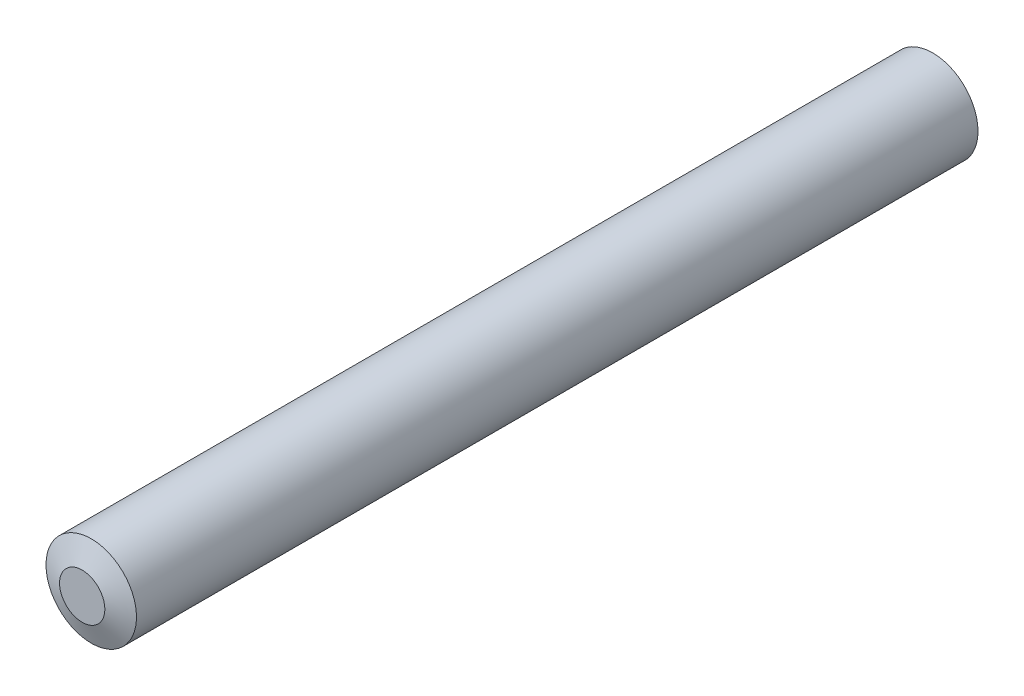
ISO-10303-21;
HEADER;
FILE_DESCRIPTION(('STEP AP214'),'2;1');
FILE_NAME('part.step','',(''),(''),'','','');
FILE_SCHEMA(('AUTOMOTIVE_DESIGN { 1 0 10303 214 1 1 1 1 }'));
ENDSEC;
DATA;
#1=APPLICATION_CONTEXT('core data for automotive mechanical design processes');
#2=APPLICATION_PROTOCOL_DEFINITION('international standard','automotive_design',2000,#1);
#3=PRODUCT_CONTEXT('',#1,'mechanical');
#4=PRODUCT('Part','Part','',(#3));
#5=PRODUCT_RELATED_PRODUCT_CATEGORY('part','',(#4));
#6=PRODUCT_DEFINITION_FORMATION('','',#4);
#7=PRODUCT_DEFINITION_CONTEXT('part definition',#1,'design');
#8=PRODUCT_DEFINITION('design','',#6,#7);
#9=PRODUCT_DEFINITION_SHAPE('','',#8);
#10=(LENGTH_UNIT() NAMED_UNIT(*) SI_UNIT(.MILLI.,.METRE.));
#11=(NAMED_UNIT(*) PLANE_ANGLE_UNIT() SI_UNIT($,.RADIAN.));
#12=(NAMED_UNIT(*) SI_UNIT($,.STERADIAN.) SOLID_ANGLE_UNIT());
#13=UNCERTAINTY_MEASURE_WITH_UNIT(LENGTH_MEASURE(1.E-05),#10,'distance_accuracy_value','');
#14=(GEOMETRIC_REPRESENTATION_CONTEXT(3) GLOBAL_UNCERTAINTY_ASSIGNED_CONTEXT((#13)) GLOBAL_UNIT_ASSIGNED_CONTEXT((#10,
#11,#12)) REPRESENTATION_CONTEXT('',''));
#15=CARTESIAN_POINT('',(0.,0.,0.));
#16=DIRECTION('',(0.,0.,1.));
#17=DIRECTION('',(1.,0.,0.));
#18=AXIS2_PLACEMENT_3D('',#15,#16,#17);
#19=CARTESIAN_POINT('',(0.,0.,37.9999999999999));
#20=DIRECTION('',(0.,0.,-0.999999999999997));
#21=DIRECTION('',(-0.999999999999997,0.,0.));
#22=AXIS2_PLACEMENT_3D('',#19,#20,#21);
#23=CYLINDRICAL_SURFACE('',#22,2.);
#24=CARTESIAN_POINT('',(0.,0.,0.399999999999991));
#25=DIRECTION('',(0.,0.,0.999999999999997));
#26=DIRECTION('',(0.999999999999997,0.,0.));
#27=AXIS2_PLACEMENT_3D('',#24,#25,#26);
#28=CIRCLE('',#27,2.);
#29=CARTESIAN_POINT('',(-2.00000000000002,0.,0.399999999999998));
#30=VERTEX_POINT('',#29);
#31=EDGE_CURVE('E36',#30,#30,#28,.T.);
#32=CARTESIAN_POINT('',(0.,0.,37.5999999999999));
#33=DIRECTION('',(0.,0.,0.999999999999997));
#34=DIRECTION('',(0.999999999999997,0.,0.));
#35=AXIS2_PLACEMENT_3D('',#32,#33,#34);
#36=CIRCLE('',#35,2.);
#37=CARTESIAN_POINT('',(-2.00000000000002,0.,37.5999999999999));
#38=VERTEX_POINT('',#37);
#39=EDGE_CURVE('E40',#38,#38,#36,.F.);
#40=CARTESIAN_POINT('',(-2.00000000000002,0.,0.399999999999998));
#41=CARTESIAN_POINT('',(-2.00000000000002,0.,0.787499999999994));
#42=CARTESIAN_POINT('',(-2.00000000000002,0.,1.17499999999999));
#43=CARTESIAN_POINT('',(-2.00000000000002,0.,1.94999999999999));
#44=CARTESIAN_POINT('',(-2.00000000000002,0.,2.33749999999999));
#45=CARTESIAN_POINT('',(-2.00000000000002,0.,3.11249999999999));
#46=CARTESIAN_POINT('',(-2.00000000000002,0.,3.49999999999998));
#47=CARTESIAN_POINT('',(-2.00000000000002,0.,4.27499999999998));
#48=CARTESIAN_POINT('',(-2.00000000000002,0.,4.66249999999998));
#49=CARTESIAN_POINT('',(-2.00000000000002,0.,5.43749999999998));
#50=CARTESIAN_POINT('',(-2.00000000000002,0.,5.82499999999998));
#51=CARTESIAN_POINT('',(-2.00000000000002,0.,6.59999999999997));
#52=CARTESIAN_POINT('',(-2.00000000000002,0.,6.98749999999997));
#53=CARTESIAN_POINT('',(-2.00000000000002,0.,7.76249999999997));
#54=CARTESIAN_POINT('',(-2.00000000000002,0.,8.14999999999997));
#55=CARTESIAN_POINT('',(-2.00000000000002,0.,8.92499999999997));
#56=CARTESIAN_POINT('',(-2.00000000000002,0.,9.31249999999997));
#57=CARTESIAN_POINT('',(-2.00000000000002,0.,10.0875));
#58=CARTESIAN_POINT('',(-2.00000000000002,0.,10.475));
#59=CARTESIAN_POINT('',(-2.00000000000002,0.,11.25));
#60=CARTESIAN_POINT('',(-2.00000000000002,0.,11.6375));
#61=CARTESIAN_POINT('',(-2.00000000000002,0.,12.4125));
#62=CARTESIAN_POINT('',(-2.00000000000002,0.,12.8));
#63=CARTESIAN_POINT('',(-2.00000000000002,0.,13.575));
#64=CARTESIAN_POINT('',(-2.00000000000002,0.,13.9625));
#65=CARTESIAN_POINT('',(-2.00000000000002,0.,14.7374999999999));
#66=CARTESIAN_POINT('',(-2.00000000000002,0.,15.1249999999999));
#67=CARTESIAN_POINT('',(-2.00000000000002,0.,15.8999999999999));
#68=CARTESIAN_POINT('',(-2.00000000000002,0.,16.2874999999999));
#69=CARTESIAN_POINT('',(-2.00000000000002,0.,17.0624999999999));
#70=CARTESIAN_POINT('',(-2.00000000000002,0.,17.4499999999999));
#71=CARTESIAN_POINT('',(-2.00000000000002,0.,18.2249999999999));
#72=CARTESIAN_POINT('',(-2.00000000000002,0.,18.6124999999999));
#73=CARTESIAN_POINT('',(-2.00000000000002,0.,19.3874999999999));
#74=CARTESIAN_POINT('',(-2.00000000000002,0.,19.7749999999999));
#75=CARTESIAN_POINT('',(-2.00000000000002,0.,20.5499999999999));
#76=CARTESIAN_POINT('',(-2.00000000000002,0.,20.9374999999999));
#77=CARTESIAN_POINT('',(-2.00000000000002,0.,21.7124999999999));
#78=CARTESIAN_POINT('',(-2.00000000000002,0.,22.0999999999999));
#79=CARTESIAN_POINT('',(-2.00000000000002,0.,22.8749999999999));
#80=CARTESIAN_POINT('',(-2.00000000000002,0.,23.2624999999999));
#81=CARTESIAN_POINT('',(-2.00000000000002,0.,24.0374999999999));
#82=CARTESIAN_POINT('',(-2.00000000000002,0.,24.4249999999999));
#83=CARTESIAN_POINT('',(-2.00000000000002,0.,25.1999999999999));
#84=CARTESIAN_POINT('',(-2.00000000000002,0.,25.5874999999999));
#85=CARTESIAN_POINT('',(-2.00000000000002,0.,26.3624999999999));
#86=CARTESIAN_POINT('',(-2.00000000000002,0.,26.7499999999999));
#87=CARTESIAN_POINT('',(-2.00000000000002,0.,27.5249999999999));
#88=CARTESIAN_POINT('',(-2.00000000000002,0.,27.9124999999999));
#89=CARTESIAN_POINT('',(-2.00000000000002,0.,28.6874999999999));
#90=CARTESIAN_POINT('',(-2.00000000000002,0.,29.0749999999999));
#91=CARTESIAN_POINT('',(-2.00000000000002,0.,29.8499999999999));
#92=CARTESIAN_POINT('',(-2.00000000000002,0.,30.2374999999999));
#93=CARTESIAN_POINT('',(-2.00000000000002,0.,31.0124999999999));
#94=CARTESIAN_POINT('',(-2.00000000000002,0.,31.3999999999999));
#95=CARTESIAN_POINT('',(-2.00000000000002,0.,32.1749999999999));
#96=CARTESIAN_POINT('',(-2.00000000000002,0.,32.5624999999999));
#97=CARTESIAN_POINT('',(-2.00000000000002,0.,33.3374999999999));
#98=CARTESIAN_POINT('',(-2.00000000000002,0.,33.7249999999999));
#99=CARTESIAN_POINT('',(-2.00000000000002,0.,34.4999999999999));
#100=CARTESIAN_POINT('',(-2.00000000000002,0.,34.8874999999999));
#101=CARTESIAN_POINT('',(-2.00000000000002,0.,35.6624999999999));
#102=CARTESIAN_POINT('',(-2.00000000000002,0.,36.0499999999999));
#103=CARTESIAN_POINT('',(-2.00000000000002,0.,36.8249999999999));
#104=CARTESIAN_POINT('',(-2.00000000000002,0.,37.2124999999999));
#105=CARTESIAN_POINT('',(-2.00000000000002,0.,37.5999999999999));
#106=B_SPLINE_CURVE_WITH_KNOTS('',3,(#40,#41,#42,#43,#44,#45,#46,#47,#48,#49,#50,#51,#52,#53,
#54,#55,#56,#57,#58,#59,#60,#61,#62,#63,#64,#65,#66,#67,#68,#69,#70,#71,#72,#73,#74,#75,#76,#77,
#78,#79,#80,#81,#82,#83,#84,#85,#86,#87,#88,#89,#90,#91,#92,#93,#94,#95,#96,#97,#98,#99,#100,
#101,#102,#103,#104,#105),.UNSPECIFIED.,.F.,.F.,(4,2,2,2,2,2,2,2,2,2,2,2,2,2,2,2,2,2,2,2,2,2,2,
2,2,2,2,2,2,2,2,2,4),(0.,1.16249999999999,2.32499999999999,3.48749999999998,4.64999999999999,
5.81249999999998,6.97499999999997,8.13749999999997,9.29999999999997,10.4625,11.625,12.7875,
13.95,15.1124999999999,16.2749999999999,17.4374999999999,18.5999999999999,19.7624999999999,
20.9249999999999,22.0874999999999,23.2499999999999,24.4124999999999,25.5749999999999,
26.7374999999999,27.8999999999999,29.0624999999999,30.2249999999999,31.3874999999999,
32.5499999999999,33.7124999999999,34.8749999999999,36.0374999999999,37.1999999999999),.UNSPECIFIED.);
#107=EDGE_CURVE('BSEAM30',#30,#38,#106,.T.);
#108=ORIENTED_EDGE('',*,*,#31,.T.);
#109=ORIENTED_EDGE('',*,*,#39,.T.);
#110=ORIENTED_EDGE('',*,*,#107,.T.);
#111=ORIENTED_EDGE('',*,*,#107,.F.);
#112=EDGE_LOOP('',(#108,#110,#109,#111));
#113=FACE_BOUND('',#112,.T.);
#114=ADVANCED_FACE('F30',(#113),#23,.T.);
#115=CARTESIAN_POINT('',(0.,0.,37.9999999999999));
#116=DIRECTION('',(0.,0.,0.999999999999997));
#117=DIRECTION('',(0.999999999999997,0.,0.));
#118=AXIS2_PLACEMENT_3D('',#115,#116,#117);
#119=PLANE('',#118);
#120=CARTESIAN_POINT('',(0.,0.,37.9999999999999));
#121=DIRECTION('',(0.,0.,0.999999999999997));
#122=DIRECTION('',(0.999999999999997,0.,0.));
#123=AXIS2_PLACEMENT_3D('',#120,#121,#122);
#124=CIRCLE('',#123,0.999999999999987);
#125=CARTESIAN_POINT('',(-1.,0.,37.9999999999999));
#126=VERTEX_POINT('',#125);
#127=EDGE_CURVE('E44',#126,#126,#124,.T.);
#128=ORIENTED_EDGE('',*,*,#127,.T.);
#129=EDGE_LOOP('',(#128));
#130=FACE_BOUND('',#129,.T.);
#131=ADVANCED_FACE('F50',(#130),#119,.T.);
#132=CARTESIAN_POINT('',(0.,0.,0.));
#133=DIRECTION('',(0.,0.,0.999999999999997));
#134=DIRECTION('',(0.999999999999997,0.,0.));
#135=AXIS2_PLACEMENT_3D('',#132,#133,#134);
#136=PLANE('',#135);
#137=CARTESIAN_POINT('',(0.,0.,0.));
#138=DIRECTION('',(0.,0.,0.999999999999997));
#139=DIRECTION('',(0.999999999999997,0.,0.));
#140=AXIS2_PLACEMENT_3D('',#137,#138,#139);
#141=CIRCLE('',#140,0.999999999999994);
#142=CARTESIAN_POINT('',(0.999999999999984,0.,0.));
#143=VERTEX_POINT('',#142);
#144=EDGE_CURVE('E10',#143,#143,#141,.F.);
#145=ORIENTED_EDGE('',*,*,#144,.T.);
#146=EDGE_LOOP('',(#145));
#147=FACE_BOUND('',#146,.T.);
#148=ADVANCED_FACE('F55',(#147),#136,.F.);
#149=CARTESIAN_POINT('',(0.,0.,37.9999999999999));
#150=DIRECTION('',(0.,0.,-0.999999999999997));
#151=DIRECTION('',(-0.999999999999997,0.,0.));
#152=AXIS2_PLACEMENT_3D('',#149,#150,#151);
#153=CONICAL_SURFACE('',#152,0.999999999999987,1.19028994968254);
#154=CARTESIAN_POINT('',(-2.00000000000005,0.,37.5999999999999));
#155=CARTESIAN_POINT('',(-1.98958333333338,0.,37.6041666666665));
#156=CARTESIAN_POINT('',(-1.97916666666672,0.,37.6083333333332));
#157=CARTESIAN_POINT('',(-1.95833333333338,0.,37.6166666666665));
#158=CARTESIAN_POINT('',(-1.94791666666672,0.,37.6208333333332));
#159=CARTESIAN_POINT('',(-1.92708333333338,0.,37.6291666666665));
#160=CARTESIAN_POINT('',(-1.91666666666671,0.,37.6333333333332));
#161=CARTESIAN_POINT('',(-1.89583333333338,0.,37.6416666666665));
#162=CARTESIAN_POINT('',(-1.88541666666671,0.,37.6458333333332));
#163=CARTESIAN_POINT('',(-1.86458333333338,0.,37.6541666666665));
#164=CARTESIAN_POINT('',(-1.85416666666671,0.,37.6583333333332));
#165=CARTESIAN_POINT('',(-1.83333333333338,0.,37.6666666666665));
#166=CARTESIAN_POINT('',(-1.82291666666671,0.,37.6708333333332));
#167=CARTESIAN_POINT('',(-1.80208333333338,0.,37.6791666666665));
#168=CARTESIAN_POINT('',(-1.79166666666671,0.,37.6833333333332));
#169=CARTESIAN_POINT('',(-1.77083333333337,0.,37.6916666666665));
#170=CARTESIAN_POINT('',(-1.76041666666671,0.,37.6958333333332));
#171=CARTESIAN_POINT('',(-1.73958333333337,0.,37.7041666666665));
#172=CARTESIAN_POINT('',(-1.7291666666667,0.,37.7083333333332));
#173=CARTESIAN_POINT('',(-1.70833333333337,0.,37.7166666666665));
#174=CARTESIAN_POINT('',(-1.6979166666667,0.,37.7208333333332));
#175=CARTESIAN_POINT('',(-1.67708333333337,0.,37.7291666666665));
#176=CARTESIAN_POINT('',(-1.6666666666667,0.,37.7333333333332));
#177=CARTESIAN_POINT('',(-1.64583333333337,0.,37.7416666666665));
#178=CARTESIAN_POINT('',(-1.6354166666667,0.,37.7458333333332));
#179=CARTESIAN_POINT('',(-1.61458333333337,0.,37.7541666666665));
#180=CARTESIAN_POINT('',(-1.6041666666667,0.,37.7583333333332));
#181=CARTESIAN_POINT('',(-1.58333333333336,0.,37.7666666666665));
#182=CARTESIAN_POINT('',(-1.5729166666667,0.,37.7708333333332));
#183=CARTESIAN_POINT('',(-1.55208333333336,0.,37.7791666666665));
#184=CARTESIAN_POINT('',(-1.5416666666667,0.,37.7833333333332));
#185=CARTESIAN_POINT('',(-1.52083333333336,0.,37.7916666666665));
#186=CARTESIAN_POINT('',(-1.51041666666669,0.,37.7958333333332));
#187=CARTESIAN_POINT('',(-1.48958333333336,0.,37.8041666666665));
#188=CARTESIAN_POINT('',(-1.47916666666669,0.,37.8083333333332));
#189=CARTESIAN_POINT('',(-1.45833333333336,0.,37.8166666666665));
#190=CARTESIAN_POINT('',(-1.44791666666669,0.,37.8208333333332));
#191=CARTESIAN_POINT('',(-1.42708333333336,0.,37.8291666666665));
#192=CARTESIAN_POINT('',(-1.41666666666669,0.,37.8333333333332));
#193=CARTESIAN_POINT('',(-1.39583333333336,0.,37.8416666666665));
#194=CARTESIAN_POINT('',(-1.38541666666669,0.,37.8458333333332));
#195=CARTESIAN_POINT('',(-1.36458333333335,0.,37.8541666666666));
#196=CARTESIAN_POINT('',(-1.35416666666669,0.,37.8583333333332));
#197=CARTESIAN_POINT('',(-1.33333333333335,0.,37.8666666666665));
#198=CARTESIAN_POINT('',(-1.32291666666669,0.,37.8708333333332));
#199=CARTESIAN_POINT('',(-1.30208333333335,0.,37.8791666666665));
#200=CARTESIAN_POINT('',(-1.29166666666668,0.,37.8833333333332));
#201=CARTESIAN_POINT('',(-1.27083333333335,0.,37.8916666666665));
#202=CARTESIAN_POINT('',(-1.26041666666668,0.,37.8958333333332));
#203=CARTESIAN_POINT('',(-1.23958333333335,0.,37.9041666666666));
#204=CARTESIAN_POINT('',(-1.22916666666668,0.,37.9083333333332));
#205=CARTESIAN_POINT('',(-1.20833333333335,0.,37.9166666666666));
#206=CARTESIAN_POINT('',(-1.19791666666668,0.,37.9208333333332));
#207=CARTESIAN_POINT('',(-1.17708333333335,0.,37.9291666666665));
#208=CARTESIAN_POINT('',(-1.16666666666668,0.,37.9333333333332));
#209=CARTESIAN_POINT('',(-1.14583333333334,0.,37.9416666666665));
#210=CARTESIAN_POINT('',(-1.13541666666668,0.,37.9458333333332));
#211=CARTESIAN_POINT('',(-1.11458333333334,0.,37.9541666666666));
#212=CARTESIAN_POINT('',(-1.10416666666668,0.,37.9583333333332));
#213=CARTESIAN_POINT('',(-1.08333333333334,0.,37.9666666666666));
#214=CARTESIAN_POINT('',(-1.07291666666667,0.,37.9708333333332));
#215=CARTESIAN_POINT('',(-1.05208333333334,0.,37.9791666666666));
#216=CARTESIAN_POINT('',(-1.04166666666667,0.,37.9833333333332));
#217=CARTESIAN_POINT('',(-1.02083333333334,0.,37.9916666666665));
#218=CARTESIAN_POINT('',(-1.01041666666667,0.,37.9958333333332));
#219=CARTESIAN_POINT('',(-1.,0.,37.9999999999999));
#220=B_SPLINE_CURVE_WITH_KNOTS('',3,(#154,#155,#156,#157,#158,#159,#160,#161,#162,#163,#164,
#165,#166,#167,#168,#169,#170,#171,#172,#173,#174,#175,#176,#177,#178,#179,#180,#181,#182,#183,
#184,#185,#186,#187,#188,#189,#190,#191,#192,#193,#194,#195,#196,#197,#198,#199,#200,#201,#202,
#203,#204,#205,#206,#207,#208,#209,#210,#211,#212,#213,#214,#215,#216,#217,#218,#219),
.UNSPECIFIED.,.F.,.F.,(4,2,2,2,2,2,2,2,2,2,2,2,2,2,2,2,2,2,2,2,2,2,2,2,2,2,2,2,2,2,2,2,4),(0.,
0.0336572800445918,0.0673145600891831,0.100971840133775,0.134629120178369,0.16828640022296,
0.201943680267552,0.235600960312143,0.269258240356738,0.302915520401329,0.33657280044592,
0.370230080490512,0.403887360535106,0.437544640579698,0.471201920624289,0.504859200668881,
0.538516480713475,0.572173760758066,0.605831040802658,0.639488320847249,0.673145600891843,
0.706802880936435,0.740460160981026,0.774117441025618,0.807774721070212,0.841432001114803,
0.875089281159395,0.908746561203986,0.942403841248581,0.976061121293172,1.00971840133776,
1.04337568138236,1.07703296142695),.UNSPECIFIED.);
#221=EDGE_CURVE('BSEAM52',#38,#126,#220,.T.);
#222=ORIENTED_EDGE('',*,*,#39,.F.);
#223=ORIENTED_EDGE('',*,*,#127,.F.);
#224=ORIENTED_EDGE('',*,*,#221,.T.);
#225=ORIENTED_EDGE('',*,*,#221,.F.);
#226=EDGE_LOOP('',(#222,#224,#223,#225));
#227=FACE_BOUND('',#226,.T.);
#228=ADVANCED_FACE('F52',(#227),#153,.T.);
#229=CARTESIAN_POINT('',(0.,0.,0.399999999999991));
#230=DIRECTION('',(0.,0.,0.999999999999997));
#231=DIRECTION('',(0.999999999999997,0.,0.));
#232=AXIS2_PLACEMENT_3D('',#229,#230,#231);
#233=CONICAL_SURFACE('',#232,2.,1.19028994968254);
#234=ORIENTED_EDGE('',*,*,#144,.F.);
#235=EDGE_LOOP('',(#234));
#236=FACE_BOUND('',#235,.T.);
#237=ORIENTED_EDGE('',*,*,#31,.F.);
#238=EDGE_LOOP('',(#237));
#239=FACE_BOUND('',#238,.T.);
#240=ADVANCED_FACE('F54',(#236,#239),#233,.T.);
#241=CLOSED_SHELL('',(#114,#131,#148,#228,#240));
#242=MANIFOLD_SOLID_BREP('B2',#241);
#243=ADVANCED_BREP_SHAPE_REPRESENTATION('',(#18,#242),#14);
#244=SHAPE_DEFINITION_REPRESENTATION(#9,#243);
ENDSEC;
END-ISO-10303-21;
